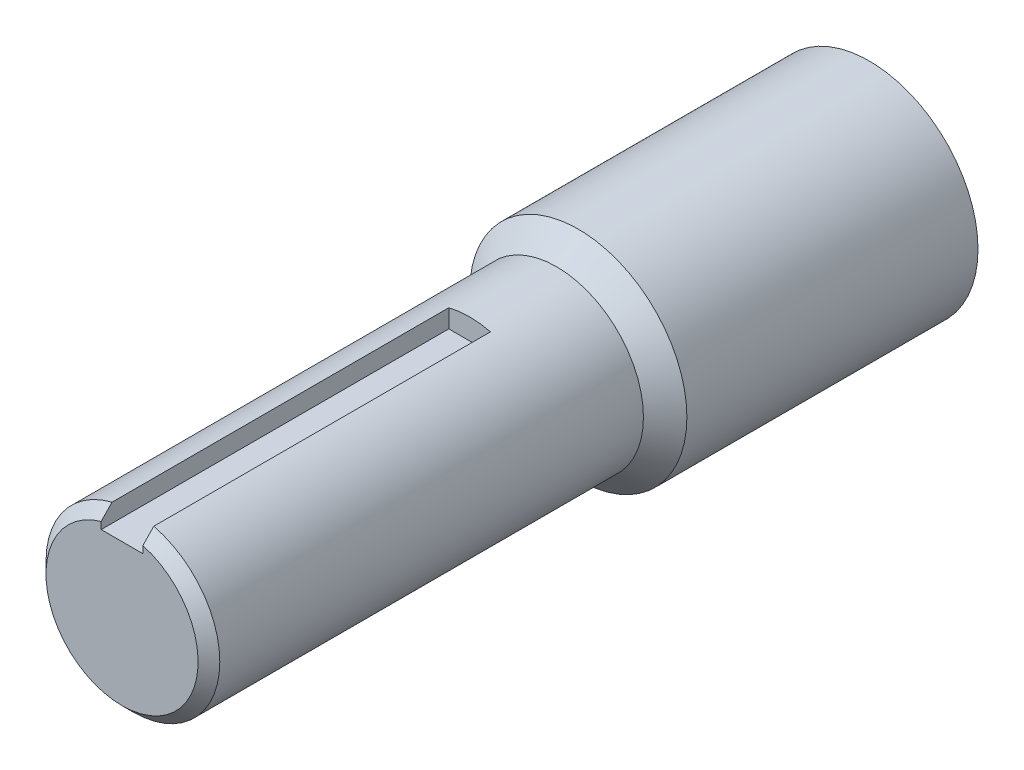
ISO-10303-21;
HEADER;
FILE_DESCRIPTION(('STEP AP214'),'2;1');
FILE_NAME('part.step','',(''),(''),'','','');
FILE_SCHEMA(('AUTOMOTIVE_DESIGN { 1 0 10303 214 1 1 1 1 }'));
ENDSEC;
DATA;
#1=APPLICATION_CONTEXT('core data for automotive mechanical design processes');
#2=APPLICATION_PROTOCOL_DEFINITION('international standard','automotive_design',2000,#1);
#3=PRODUCT_CONTEXT('',#1,'mechanical');
#4=PRODUCT('Part','Part','',(#3));
#5=PRODUCT_RELATED_PRODUCT_CATEGORY('part','',(#4));
#6=PRODUCT_DEFINITION_FORMATION('','',#4);
#7=PRODUCT_DEFINITION_CONTEXT('part definition',#1,'design');
#8=PRODUCT_DEFINITION('design','',#6,#7);
#9=PRODUCT_DEFINITION_SHAPE('','',#8);
#10=(LENGTH_UNIT() NAMED_UNIT(*) SI_UNIT(.MILLI.,.METRE.));
#11=(NAMED_UNIT(*) PLANE_ANGLE_UNIT() SI_UNIT($,.RADIAN.));
#12=(NAMED_UNIT(*) SI_UNIT($,.STERADIAN.) SOLID_ANGLE_UNIT());
#13=UNCERTAINTY_MEASURE_WITH_UNIT(LENGTH_MEASURE(1.E-05),#10,'distance_accuracy_value','');
#14=(GEOMETRIC_REPRESENTATION_CONTEXT(3) GLOBAL_UNCERTAINTY_ASSIGNED_CONTEXT((#13)) GLOBAL_UNIT_ASSIGNED_CONTEXT((#10,
#11,#12)) REPRESENTATION_CONTEXT('',''));
#15=CARTESIAN_POINT('',(0.,0.,0.));
#16=DIRECTION('',(0.,0.,1.));
#17=DIRECTION('',(1.,0.,0.));
#18=AXIS2_PLACEMENT_3D('',#15,#16,#17);
#19=CARTESIAN_POINT('',(0.,0.,-19.05));
#20=DIRECTION('',(0.,0.,1.));
#21=DIRECTION('',(1.,0.,0.));
#22=AXIS2_PLACEMENT_3D('',#19,#20,#21);
#23=CYLINDRICAL_SURFACE('',#22,7.9375);
#24=CARTESIAN_POINT('',(0.,0.,2.22250000000001));
#25=DIRECTION('',(0.,0.,1.));
#26=DIRECTION('',(1.,0.,0.));
#27=AXIS2_PLACEMENT_3D('',#24,#25,#26);
#28=CIRCLE('',#27,7.9375);
#29=CARTESIAN_POINT('',(7.9375,0.,2.22250000000001));
#30=VERTEX_POINT('',#29);
#31=EDGE_CURVE('E118',#30,#30,#28,.F.);
#32=CARTESIAN_POINT('',(0.,0.,-19.05));
#33=DIRECTION('',(0.,0.,1.));
#34=DIRECTION('',(1.,0.,0.));
#35=AXIS2_PLACEMENT_3D('',#32,#33,#34);
#36=CIRCLE('',#35,7.9375);
#37=CARTESIAN_POINT('',(7.9375,0.,-19.05));
#38=VERTEX_POINT('',#37);
#39=EDGE_CURVE('E115',#38,#38,#36,.T.);
#40=CARTESIAN_POINT('',(7.9375,0.,2.22250000000001));
#41=CARTESIAN_POINT('',(7.9375,0.,2.00091145833334));
#42=CARTESIAN_POINT('',(7.9375,0.,1.77932291666668));
#43=CARTESIAN_POINT('',(7.9375,0.,1.33614583333334));
#44=CARTESIAN_POINT('',(7.9375,0.,1.11455729166667));
#45=CARTESIAN_POINT('',(7.9375,0.,0.671380208333341));
#46=CARTESIAN_POINT('',(7.9375,0.,0.449791666666674));
#47=CARTESIAN_POINT('',(7.9375,0.,0.0066145833333397));
#48=CARTESIAN_POINT('',(7.9375,0.,-0.214973958333327));
#49=CARTESIAN_POINT('',(7.9375,0.,-0.65815104166666));
#50=CARTESIAN_POINT('',(7.9375,0.,-0.879739583333326));
#51=CARTESIAN_POINT('',(7.9375,0.,-1.32291666666666));
#52=CARTESIAN_POINT('',(7.9375,0.,-1.54450520833333));
#53=CARTESIAN_POINT('',(7.9375,0.,-1.98768229166666));
#54=CARTESIAN_POINT('',(7.9375,0.,-2.20927083333333));
#55=CARTESIAN_POINT('',(7.9375,0.,-2.65244791666666));
#56=CARTESIAN_POINT('',(7.9375,0.,-2.87403645833333));
#57=CARTESIAN_POINT('',(7.9375,0.,-3.31721354166666));
#58=CARTESIAN_POINT('',(7.9375,0.,-3.53880208333333));
#59=CARTESIAN_POINT('',(7.9375,0.,-3.98197916666666));
#60=CARTESIAN_POINT('',(7.9375,0.,-4.20356770833333));
#61=CARTESIAN_POINT('',(7.9375,0.,-4.64674479166666));
#62=CARTESIAN_POINT('',(7.9375,0.,-4.86833333333333));
#63=CARTESIAN_POINT('',(7.9375,0.,-5.31151041666666));
#64=CARTESIAN_POINT('',(7.9375,0.,-5.53309895833333));
#65=CARTESIAN_POINT('',(7.9375,0.,-5.97627604166666));
#66=CARTESIAN_POINT('',(7.9375,0.,-6.19786458333333));
#67=CARTESIAN_POINT('',(7.9375,0.,-6.64104166666666));
#68=CARTESIAN_POINT('',(7.9375,0.,-6.86263020833333));
#69=CARTESIAN_POINT('',(7.9375,0.,-7.30580729166666));
#70=CARTESIAN_POINT('',(7.9375,0.,-7.52739583333333));
#71=CARTESIAN_POINT('',(7.9375,0.,-7.97057291666666));
#72=CARTESIAN_POINT('',(7.9375,0.,-8.19216145833333));
#73=CARTESIAN_POINT('',(7.9375,0.,-8.63533854166666));
#74=CARTESIAN_POINT('',(7.9375,0.,-8.85692708333333));
#75=CARTESIAN_POINT('',(7.9375,0.,-9.30010416666666));
#76=CARTESIAN_POINT('',(7.9375,0.,-9.52169270833333));
#77=CARTESIAN_POINT('',(7.9375,0.,-9.96486979166666));
#78=CARTESIAN_POINT('',(7.9375,0.,-10.1864583333333));
#79=CARTESIAN_POINT('',(7.9375,0.,-10.6296354166667));
#80=CARTESIAN_POINT('',(7.9375,0.,-10.8512239583333));
#81=CARTESIAN_POINT('',(7.9375,0.,-11.2944010416667));
#82=CARTESIAN_POINT('',(7.9375,0.,-11.5159895833333));
#83=CARTESIAN_POINT('',(7.9375,0.,-11.9591666666667));
#84=CARTESIAN_POINT('',(7.9375,0.,-12.1807552083333));
#85=CARTESIAN_POINT('',(7.9375,0.,-12.6239322916667));
#86=CARTESIAN_POINT('',(7.9375,0.,-12.8455208333333));
#87=CARTESIAN_POINT('',(7.9375,0.,-13.2886979166667));
#88=CARTESIAN_POINT('',(7.9375,0.,-13.5102864583333));
#89=CARTESIAN_POINT('',(7.9375,0.,-13.9534635416667));
#90=CARTESIAN_POINT('',(7.9375,0.,-14.1750520833333));
#91=CARTESIAN_POINT('',(7.9375,0.,-14.6182291666667));
#92=CARTESIAN_POINT('',(7.9375,0.,-14.8398177083333));
#93=CARTESIAN_POINT('',(7.9375,0.,-15.2829947916667));
#94=CARTESIAN_POINT('',(7.9375,0.,-15.5045833333333));
#95=CARTESIAN_POINT('',(7.9375,0.,-15.9477604166667));
#96=CARTESIAN_POINT('',(7.9375,0.,-16.1693489583333));
#97=CARTESIAN_POINT('',(7.9375,0.,-16.6125260416667));
#98=CARTESIAN_POINT('',(7.9375,0.,-16.8341145833333));
#99=CARTESIAN_POINT('',(7.9375,0.,-17.2772916666667));
#100=CARTESIAN_POINT('',(7.9375,0.,-17.4988802083333));
#101=CARTESIAN_POINT('',(7.9375,0.,-17.9420572916667));
#102=CARTESIAN_POINT('',(7.9375,0.,-18.1636458333333));
#103=CARTESIAN_POINT('',(7.9375,0.,-18.6068229166667));
#104=CARTESIAN_POINT('',(7.9375,0.,-18.8284114583333));
#105=CARTESIAN_POINT('',(7.9375,0.,-19.05));
#106=B_SPLINE_CURVE_WITH_KNOTS('',3,(#40,#41,#42,#43,#44,#45,#46,#47,#48,#49,#50,#51,#52,#53,
#54,#55,#56,#57,#58,#59,#60,#61,#62,#63,#64,#65,#66,#67,#68,#69,#70,#71,#72,#73,#74,#75,#76,#77,
#78,#79,#80,#81,#82,#83,#84,#85,#86,#87,#88,#89,#90,#91,#92,#93,#94,#95,#96,#97,#98,#99,#100,
#101,#102,#103,#104,#105),.UNSPECIFIED.,.F.,.F.,(4,2,2,2,2,2,2,2,2,2,2,2,2,2,2,2,2,2,2,2,2,2,2,
2,2,2,2,2,2,2,2,2,4),(0.,0.664765625000001,1.32953125,1.994296875,2.6590625,3.323828125,
3.98859375,4.653359375,5.318125,5.982890625,6.64765625,7.312421875,7.9771875,8.641953125,
9.30671875,9.971484375,10.63625,11.301015625,11.96578125,12.630546875,13.2953125,13.960078125,
14.62484375,15.289609375,15.954375,16.619140625,17.28390625,17.948671875,18.6134375,
19.278203125,19.94296875,20.607734375,21.2725),.UNSPECIFIED.);
#107=EDGE_CURVE('BSEAM32',#30,#38,#106,.T.);
#108=ORIENTED_EDGE('',*,*,#31,.T.);
#109=ORIENTED_EDGE('',*,*,#39,.T.);
#110=ORIENTED_EDGE('',*,*,#107,.T.);
#111=ORIENTED_EDGE('',*,*,#107,.F.);
#112=EDGE_LOOP('',(#108,#110,#109,#111));
#113=FACE_BOUND('',#112,.T.);
#114=ADVANCED_FACE('F32',(#113),#23,.T.);
#115=CARTESIAN_POINT('',(0.,0.,-19.05));
#116=DIRECTION('',(0.,0.,1.));
#117=DIRECTION('',(1.,0.,0.));
#118=AXIS2_PLACEMENT_3D('',#115,#116,#117);
#119=PLANE('',#118);
#120=ORIENTED_EDGE('',*,*,#39,.F.);
#121=EDGE_LOOP('',(#120));
#122=FACE_BOUND('',#121,.T.);
#123=ADVANCED_FACE('F153',(#122),#119,.F.);
#124=CARTESIAN_POINT('',(0.,0.,35.56));
#125=DIRECTION('',(0.,0.,-1.));
#126=DIRECTION('',(-1.,0.,0.));
#127=AXIS2_PLACEMENT_3D('',#124,#125,#126);
#128=CYLINDRICAL_SURFACE('',#127,6.35);
#129=CARTESIAN_POINT('',(0.,0.,34.76625));
#130=DIRECTION('',(0.,0.,1.));
#131=DIRECTION('',(1.,0.,0.));
#132=AXIS2_PLACEMENT_3D('',#129,#130,#131);
#133=CIRCLE('',#132,6.35);
#134=CARTESIAN_POINT('',(1.524,6.16440783855189,34.76625));
#135=VERTEX_POINT('',#134);
#136=CARTESIAN_POINT('',(-1.524,6.16440783855189,34.76625));
#137=VERTEX_POINT('',#136);
#138=EDGE_CURVE('E124',#135,#137,#133,.F.);
#139=ORIENTED_EDGE('',*,*,#138,.T.);
#140=DIRECTION('',(0.,0.,-1.));
#141=VECTOR('',#140,1.);
#142=CARTESIAN_POINT('',(-1.524,6.16440783855189,35.56));
#143=LINE('',#142,#141);
#144=CARTESIAN_POINT('',(-1.524,6.16440783855189,10.16));
#145=VERTEX_POINT('',#144);
#146=EDGE_CURVE('E56',#137,#145,#143,.T.);
#147=ORIENTED_EDGE('',*,*,#146,.T.);
#148=CARTESIAN_POINT('',(0.,0.,10.16));
#149=DIRECTION('',(0.,0.,-1.));
#150=DIRECTION('',(-1.,0.,0.));
#151=AXIS2_PLACEMENT_3D('',#148,#149,#150);
#152=CIRCLE('',#151,6.35);
#153=CARTESIAN_POINT('',(1.524,6.16440783855189,10.16));
#154=VERTEX_POINT('',#153);
#155=EDGE_CURVE('E11',#145,#154,#152,.T.);
#156=ORIENTED_EDGE('',*,*,#155,.T.);
#157=DIRECTION('',(0.,0.,-1.));
#158=VECTOR('',#157,1.);
#159=CARTESIAN_POINT('',(1.524,6.16440783855189,35.56));
#160=LINE('',#159,#158);
#161=EDGE_CURVE('E107',#154,#135,#160,.F.);
#162=ORIENTED_EDGE('',*,*,#161,.T.);
#163=EDGE_LOOP('',(#139,#147,#156,#162));
#164=FACE_BOUND('',#163,.T.);
#165=CARTESIAN_POINT('',(0.,0.,3.81));
#166=DIRECTION('',(0.,0.,1.));
#167=DIRECTION('',(1.,0.,0.));
#168=AXIS2_PLACEMENT_3D('',#165,#166,#167);
#169=CIRCLE('',#168,6.35);
#170=CARTESIAN_POINT('',(6.35,0.,3.81));
#171=VERTEX_POINT('',#170);
#172=EDGE_CURVE('E112',#171,#171,#169,.T.);
#173=ORIENTED_EDGE('',*,*,#172,.T.);
#174=EDGE_LOOP('',(#173));
#175=FACE_BOUND('',#174,.T.);
#176=ADVANCED_FACE('F149',(#164,#175),#128,.T.);
#177=CARTESIAN_POINT('',(0.,0.,35.56));
#178=DIRECTION('',(0.,0.,1.));
#179=DIRECTION('',(1.,0.,0.));
#180=AXIS2_PLACEMENT_3D('',#177,#178,#179);
#181=PLANE('',#180);
#182=DIRECTION('',(0.,-1.,0.));
#183=VECTOR('',#182,1.);
#184=CARTESIAN_POINT('',(-1.524,4.826,35.56));
#185=LINE('',#184,#183);
#186=CARTESIAN_POINT('',(-1.524,5.34315806078203,35.56));
#187=VERTEX_POINT('',#186);
#188=CARTESIAN_POINT('',(-1.524,4.826,35.56));
#189=VERTEX_POINT('',#188);
#190=EDGE_CURVE('E91',#187,#189,#185,.T.);
#191=ORIENTED_EDGE('',*,*,#190,.F.);
#192=CARTESIAN_POINT('',(0.,0.,35.56));
#193=DIRECTION('',(0.,0.,1.));
#194=DIRECTION('',(1.,0.,0.));
#195=AXIS2_PLACEMENT_3D('',#192,#193,#194);
#196=CIRCLE('',#195,5.55625);
#197=CARTESIAN_POINT('',(1.524,5.34315806078203,35.56));
#198=VERTEX_POINT('',#197);
#199=EDGE_CURVE('E121',#187,#198,#196,.T.);
#200=ORIENTED_EDGE('',*,*,#199,.T.);
#201=DIRECTION('',(0.,1.,0.));
#202=VECTOR('',#201,1.);
#203=CARTESIAN_POINT('',(1.524,4.826,35.56));
#204=LINE('',#203,#202);
#205=CARTESIAN_POINT('',(1.524,4.826,35.56));
#206=VERTEX_POINT('',#205);
#207=EDGE_CURVE('E48',#206,#198,#204,.T.);
#208=ORIENTED_EDGE('',*,*,#207,.F.);
#209=DIRECTION('',(1.,0.,0.));
#210=VECTOR('',#209,1.);
#211=CARTESIAN_POINT('',(-1.524,4.826,35.56));
#212=LINE('',#211,#210);
#213=EDGE_CURVE('E104',#189,#206,#212,.T.);
#214=ORIENTED_EDGE('',*,*,#213,.F.);
#215=EDGE_LOOP('',(#191,#200,#208,#214));
#216=FACE_BOUND('',#215,.T.);
#217=ADVANCED_FACE('F145',(#216),#181,.T.);
#218=CARTESIAN_POINT('',(0.,0.,3.81));
#219=DIRECTION('',(0.,0.,-1.));
#220=DIRECTION('',(-1.,0.,0.));
#221=AXIS2_PLACEMENT_3D('',#218,#219,#220);
#222=CONICAL_SURFACE('',#221,6.35000000000001,0.785398163397448);
#223=ORIENTED_EDGE('',*,*,#31,.F.);
#224=EDGE_LOOP('',(#223));
#225=FACE_BOUND('',#224,.T.);
#226=ORIENTED_EDGE('',*,*,#172,.F.);
#227=EDGE_LOOP('',(#226));
#228=FACE_BOUND('',#227,.T.);
#229=ADVANCED_FACE('F148',(#225,#228),#222,.T.);
#230=CARTESIAN_POINT('',(0.,0.,35.56));
#231=DIRECTION('',(0.,0.,-1.));
#232=DIRECTION('',(-1.,0.,0.));
#233=AXIS2_PLACEMENT_3D('',#230,#231,#232);
#234=CONICAL_SURFACE('',#233,5.55625,0.785398163397443);
#235=CARTESIAN_POINT('',(-1.524,7.90770343309907,33.0630301727603));
#236=CARTESIAN_POINT('',(-1.524,7.70536839868783,33.2616993074951));
#237=CARTESIAN_POINT('',(-1.524,7.50290603356438,33.4602391082206));
#238=CARTESIAN_POINT('',(-1.524,7.09763396352237,33.8569643071871));
#239=CARTESIAN_POINT('',(-1.524,6.89482425819639,34.0551497050119));
#240=CARTESIAN_POINT('',(-1.524,6.48878646293511,34.4510492661887));
#241=CARTESIAN_POINT('',(-1.524,6.28555841880509,34.6487634764985));
#242=CARTESIAN_POINT('',(-1.524,5.87852065038055,35.0435960298257));
#243=CARTESIAN_POINT('',(-1.524,5.67471092124337,35.240714367854));
#244=CARTESIAN_POINT('',(-1.524,5.26628194326408,35.6341613708548));
#245=CARTESIAN_POINT('',(-1.524,5.06166259800808,35.8304899357966));
#246=CARTESIAN_POINT('',(-1.524,4.65133456870982,36.2219993592062));
#247=CARTESIAN_POINT('',(-1.524,4.44562590703517,36.4171802410678));
#248=CARTESIAN_POINT('',(-1.524,4.13584918572932,36.7086863746758));
#249=CARTESIAN_POINT('',(-1.524,4.03238189766707,36.8056498605112));
#250=CARTESIAN_POINT('',(-1.524,3.82494935760286,36.9990415005349));
#251=CARTESIAN_POINT('',(-1.524,3.72098410922365,37.0954696586067));
#252=CARTESIAN_POINT('',(-1.524,3.51242861043662,37.2876632604821));
#253=CARTESIAN_POINT('',(-1.524,3.40783831783253,37.3834286585795));
#254=CARTESIAN_POINT('',(-1.524,3.19785534844476,37.5740804264585));
#255=CARTESIAN_POINT('',(-1.524,3.092462651588,37.668966774117));
#256=CARTESIAN_POINT('',(-1.524,2.98657916156365,37.7633063547405));
#257=B_SPLINE_CURVE_WITH_KNOTS('',3,(#235,#236,#237,#238,#239,#240,#241,#242,#243,#244,#245,
#246,#247,#248,#249,#250,#251,#252,#253,#254,#255,#256),.UNSPECIFIED.,.F.,.F.,(4,2,2,2,2,2,2,2,
2,2,4),(0.,0.850694156268426,1.70138931104573,2.55199580941694,3.40260941006126,
4.25332755374618,5.10402829632507,5.52942847899063,5.95482557147861,6.38025171413666,
6.80568853451816),.UNSPECIFIED.);
#258=EDGE_CURVE('E41',#137,#187,#257,.T.);
#259=ORIENTED_EDGE('',*,*,#258,.F.);
#260=ORIENTED_EDGE('',*,*,#138,.F.);
#261=CARTESIAN_POINT('',(1.524,2.98657916156365,37.7633063547405));
#262=CARTESIAN_POINT('',(1.524,3.092462651588,37.668966774117));
#263=CARTESIAN_POINT('',(1.524,3.19785534844476,37.5740804264585));
#264=CARTESIAN_POINT('',(1.524,3.40783831783253,37.3834286585795));
#265=CARTESIAN_POINT('',(1.524,3.51242861043661,37.2876632604821));
#266=CARTESIAN_POINT('',(1.524,3.72098410922365,37.0954696586067));
#267=CARTESIAN_POINT('',(1.524,3.82494935760287,36.9990415005349));
#268=CARTESIAN_POINT('',(1.524,4.03238189766708,36.8056498605112));
#269=CARTESIAN_POINT('',(1.524,4.13584918572932,36.7086863746758));
#270=CARTESIAN_POINT('',(1.524,4.44562590703517,36.4171802410678));
#271=CARTESIAN_POINT('',(1.524,4.65133456870982,36.2219993592062));
#272=CARTESIAN_POINT('',(1.524,5.06166259800808,35.8304899357966));
#273=CARTESIAN_POINT('',(1.524,5.26628194326408,35.6341613708548));
#274=CARTESIAN_POINT('',(1.524,5.67471092124337,35.240714367854));
#275=CARTESIAN_POINT('',(1.524,5.87852065038055,35.0435960298257));
#276=CARTESIAN_POINT('',(1.524,6.28555841880509,34.6487634764986));
#277=CARTESIAN_POINT('',(1.524,6.48878646293511,34.4510492661887));
#278=CARTESIAN_POINT('',(1.524,6.89482425819639,34.0551497050119));
#279=CARTESIAN_POINT('',(1.524,7.09763396352237,33.8569643071871));
#280=CARTESIAN_POINT('',(1.524,7.50290603356438,33.4602391082205));
#281=CARTESIAN_POINT('',(1.524,7.70536839868783,33.2616993074951));
#282=CARTESIAN_POINT('',(1.524,7.90770343309907,33.0630301727603));
#283=B_SPLINE_CURVE_WITH_KNOTS('',3,(#261,#262,#263,#264,#265,#266,#267,#268,#269,#270,#271,
#272,#273,#274,#275,#276,#277,#278,#279,#280,#281,#282),.UNSPECIFIED.,.F.,.F.,(4,2,2,2,2,2,2,2,
2,2,4),(0.,0.42543682038149,0.850862963039546,1.27626005552752,1.70166023819309,
2.55236098077196,3.4030791244569,4.25369272510121,5.10429922347242,5.95499437824973,
6.80568853451816),.UNSPECIFIED.);
#284=EDGE_CURVE('E127',#198,#135,#283,.T.);
#285=ORIENTED_EDGE('',*,*,#284,.F.);
#286=ORIENTED_EDGE('',*,*,#199,.F.);
#287=EDGE_LOOP('',(#259,#260,#285,#286));
#288=FACE_BOUND('',#287,.T.);
#289=ADVANCED_FACE('F34',(#288),#234,.T.);
#290=CARTESIAN_POINT('',(0.,0.,10.16));
#291=DIRECTION('',(0.,0.,-1.));
#292=DIRECTION('',(-1.,0.,0.));
#293=AXIS2_PLACEMENT_3D('',#290,#291,#292);
#294=PLANE('',#293);
#295=DIRECTION('',(0.,-1.,0.));
#296=VECTOR('',#295,1.);
#297=CARTESIAN_POINT('',(-1.524,4.826,10.16));
#298=LINE('',#297,#296);
#299=CARTESIAN_POINT('',(-1.524,4.826,10.16));
#300=VERTEX_POINT('',#299);
#301=EDGE_CURVE('E80',#145,#300,#298,.T.);
#302=ORIENTED_EDGE('',*,*,#301,.T.);
#303=DIRECTION('',(1.,0.,0.));
#304=VECTOR('',#303,1.);
#305=CARTESIAN_POINT('',(-1.524,4.826,10.16));
#306=LINE('',#305,#304);
#307=CARTESIAN_POINT('',(1.524,4.826,10.16));
#308=VERTEX_POINT('',#307);
#309=EDGE_CURVE('E85',#300,#308,#306,.T.);
#310=ORIENTED_EDGE('',*,*,#309,.T.);
#311=DIRECTION('',(0.,1.,0.));
#312=VECTOR('',#311,1.);
#313=CARTESIAN_POINT('',(1.524,4.826,10.16));
#314=LINE('',#313,#312);
#315=EDGE_CURVE('E96',#308,#154,#314,.T.);
#316=ORIENTED_EDGE('',*,*,#315,.T.);
#317=ORIENTED_EDGE('',*,*,#155,.F.);
#318=EDGE_LOOP('',(#302,#310,#316,#317));
#319=FACE_BOUND('',#318,.T.);
#320=ADVANCED_FACE('F82',(#319),#294,.F.);
#321=CARTESIAN_POINT('',(-1.524,4.826,10.16));
#322=DIRECTION('',(-1.,0.,0.));
#323=DIRECTION('',(0.,0.,1.));
#324=AXIS2_PLACEMENT_3D('',#321,#322,#323);
#325=PLANE('',#324);
#326=ORIENTED_EDGE('',*,*,#258,.T.);
#327=ORIENTED_EDGE('',*,*,#190,.T.);
#328=DIRECTION('',(0.,0.,1.));
#329=VECTOR('',#328,1.);
#330=CARTESIAN_POINT('',(-1.524,4.826,10.16));
#331=LINE('',#330,#329);
#332=EDGE_CURVE('E88',#300,#189,#331,.T.);
#333=ORIENTED_EDGE('',*,*,#332,.F.);
#334=ORIENTED_EDGE('',*,*,#301,.F.);
#335=ORIENTED_EDGE('',*,*,#146,.F.);
#336=EDGE_LOOP('',(#326,#327,#333,#334,#335));
#337=FACE_BOUND('',#336,.T.);
#338=ADVANCED_FACE('F89',(#337),#325,.F.);
#339=CARTESIAN_POINT('',(1.524,4.826,10.16));
#340=DIRECTION('',(1.,0.,0.));
#341=DIRECTION('',(0.,0.,-1.));
#342=AXIS2_PLACEMENT_3D('',#339,#340,#341);
#343=PLANE('',#342);
#344=ORIENTED_EDGE('',*,*,#315,.F.);
#345=DIRECTION('',(0.,0.,1.));
#346=VECTOR('',#345,1.);
#347=CARTESIAN_POINT('',(1.524,4.826,10.16));
#348=LINE('',#347,#346);
#349=EDGE_CURVE('E95',#308,#206,#348,.T.);
#350=ORIENTED_EDGE('',*,*,#349,.T.);
#351=ORIENTED_EDGE('',*,*,#207,.T.);
#352=ORIENTED_EDGE('',*,*,#284,.T.);
#353=ORIENTED_EDGE('',*,*,#161,.F.);
#354=EDGE_LOOP('',(#344,#350,#351,#352,#353));
#355=FACE_BOUND('',#354,.T.);
#356=ADVANCED_FACE('F136',(#355),#343,.F.);
#357=CARTESIAN_POINT('',(-1.524,4.826,10.16));
#358=DIRECTION('',(0.,-1.,0.));
#359=DIRECTION('',(0.,0.,-1.));
#360=AXIS2_PLACEMENT_3D('',#357,#358,#359);
#361=PLANE('',#360);
#362=ORIENTED_EDGE('',*,*,#213,.T.);
#363=ORIENTED_EDGE('',*,*,#349,.F.);
#364=ORIENTED_EDGE('',*,*,#309,.F.);
#365=ORIENTED_EDGE('',*,*,#332,.T.);
#366=EDGE_LOOP('',(#362,#363,#364,#365));
#367=FACE_BOUND('',#366,.T.);
#368=ADVANCED_FACE('F98',(#367),#361,.F.);
#369=CLOSED_SHELL('',(#114,#123,#176,#217,#229,#289,#320,#338,#356,#368));
#370=MANIFOLD_SOLID_BREP('B2',#369);
#371=ADVANCED_BREP_SHAPE_REPRESENTATION('',(#18,#370),#14);
#372=SHAPE_DEFINITION_REPRESENTATION(#9,#371);
ENDSEC;
END-ISO-10303-21;
